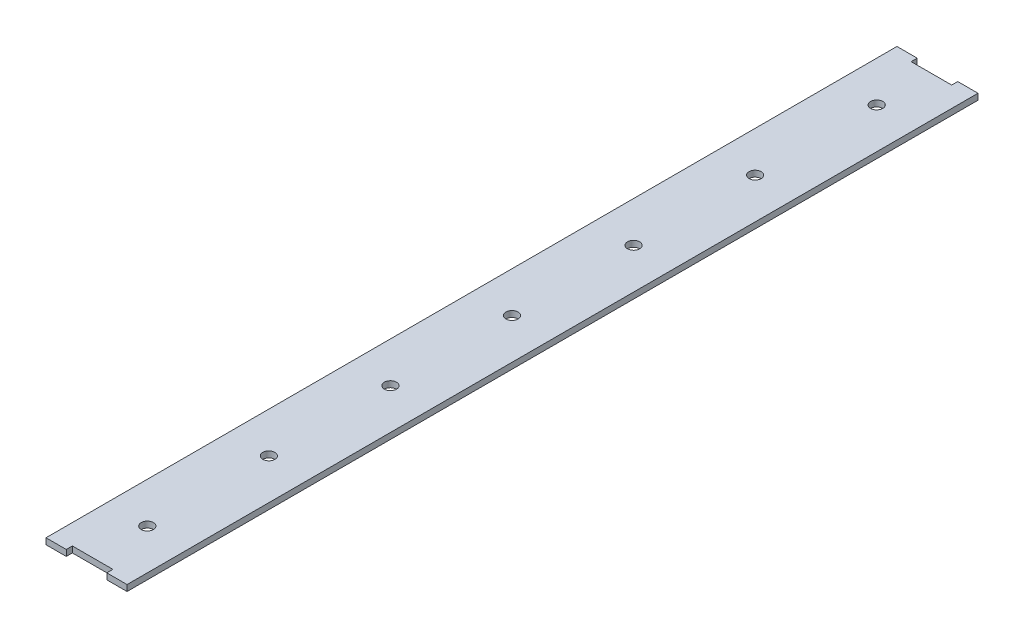
ISO-10303-21;
HEADER;
FILE_DESCRIPTION(('STEP AP214'),'2;1');
FILE_NAME('part.step','',(''),(''),'','','');
FILE_SCHEMA(('AUTOMOTIVE_DESIGN { 1 0 10303 214 1 1 1 1 }'));
ENDSEC;
DATA;
#1=APPLICATION_CONTEXT('core data for automotive mechanical design processes');
#2=APPLICATION_PROTOCOL_DEFINITION('international standard','automotive_design',2000,#1);
#3=PRODUCT_CONTEXT('',#1,'mechanical');
#4=PRODUCT('Part','Part','',(#3));
#5=PRODUCT_RELATED_PRODUCT_CATEGORY('part','',(#4));
#6=PRODUCT_DEFINITION_FORMATION('','',#4);
#7=PRODUCT_DEFINITION_CONTEXT('part definition',#1,'design');
#8=PRODUCT_DEFINITION('design','',#6,#7);
#9=PRODUCT_DEFINITION_SHAPE('','',#8);
#10=(LENGTH_UNIT() NAMED_UNIT(*) SI_UNIT(.MILLI.,.METRE.));
#11=(NAMED_UNIT(*) PLANE_ANGLE_UNIT() SI_UNIT($,.RADIAN.));
#12=(NAMED_UNIT(*) SI_UNIT($,.STERADIAN.) SOLID_ANGLE_UNIT());
#13=UNCERTAINTY_MEASURE_WITH_UNIT(LENGTH_MEASURE(1.E-05),#10,'distance_accuracy_value','');
#14=(GEOMETRIC_REPRESENTATION_CONTEXT(3) GLOBAL_UNCERTAINTY_ASSIGNED_CONTEXT((#13)) GLOBAL_UNIT_ASSIGNED_CONTEXT((#10,
#11,#12)) REPRESENTATION_CONTEXT('',''));
#15=CARTESIAN_POINT('',(0.,0.,0.));
#16=DIRECTION('',(0.,0.,1.));
#17=DIRECTION('',(1.,0.,0.));
#18=AXIS2_PLACEMENT_3D('',#15,#16,#17);
#19=CARTESIAN_POINT('',(0.,3.,-420.));
#20=DIRECTION('',(0.,0.,-1.));
#21=DIRECTION('',(-1.,0.,0.));
#22=AXIS2_PLACEMENT_3D('',#19,#20,#21);
#23=PLANE('',#22);
#24=DIRECTION('',(1.,0.,0.));
#25=VECTOR('',#24,1.);
#26=CARTESIAN_POINT('',(0.,0.,-420.));
#27=LINE('',#26,#25);
#28=CARTESIAN_POINT('',(9.99999999999995,0.,-420.));
#29=VERTEX_POINT('',#28);
#30=CARTESIAN_POINT('',(20.,0.,-420.));
#31=VERTEX_POINT('',#30);
#32=EDGE_CURVE('E196',#29,#31,#27,.T.);
#33=ORIENTED_EDGE('',*,*,#32,.F.);
#34=DIRECTION('',(0.,-1.,0.));
#35=VECTOR('',#34,1.);
#36=CARTESIAN_POINT('',(9.99999999999995,3.,-420.));
#37=LINE('',#36,#35);
#38=CARTESIAN_POINT('',(9.99999999999995,3.,-420.));
#39=VERTEX_POINT('',#38);
#40=EDGE_CURVE('E11',#39,#29,#37,.T.);
#41=ORIENTED_EDGE('',*,*,#40,.F.);
#42=DIRECTION('',(1.,0.,0.));
#43=VECTOR('',#42,1.);
#44=CARTESIAN_POINT('',(0.,3.,-420.));
#45=LINE('',#44,#43);
#46=CARTESIAN_POINT('',(20.,3.,-420.));
#47=VERTEX_POINT('',#46);
#48=EDGE_CURVE('E288',#39,#47,#45,.T.);
#49=ORIENTED_EDGE('',*,*,#48,.T.);
#50=DIRECTION('',(0.,-1.,0.));
#51=VECTOR('',#50,1.);
#52=CARTESIAN_POINT('',(20.,3.,-420.));
#53=LINE('',#52,#51);
#54=EDGE_CURVE('E104',#47,#31,#53,.T.);
#55=ORIENTED_EDGE('',*,*,#54,.T.);
#56=EDGE_LOOP('',(#33,#41,#49,#55));
#57=FACE_BOUND('',#56,.T.);
#58=ADVANCED_FACE('F39',(#57),#23,.T.);
#59=CARTESIAN_POINT('',(10.0000000000068,3.,-1.61907524424611E-13));
#60=DIRECTION('',(1.,0.,0.));
#61=DIRECTION('',(0.,0.,-1.));
#62=AXIS2_PLACEMENT_3D('',#59,#60,#61);
#63=PLANE('',#62);
#64=DIRECTION('',(0.,0.,1.));
#65=VECTOR('',#64,1.);
#66=CARTESIAN_POINT('',(10.0000000000068,0.,-1.61907524424611E-13));
#67=LINE('',#66,#65);
#68=CARTESIAN_POINT('',(10.,0.,-417.));
#69=VERTEX_POINT('',#68);
#70=EDGE_CURVE('E199',#29,#69,#67,.T.);
#71=ORIENTED_EDGE('',*,*,#70,.T.);
#72=DIRECTION('',(0.,-1.,0.));
#73=VECTOR('',#72,1.);
#74=CARTESIAN_POINT('',(10.,3.,-417.));
#75=LINE('',#74,#73);
#76=CARTESIAN_POINT('',(10.,3.,-417.));
#77=VERTEX_POINT('',#76);
#78=EDGE_CURVE('E49',#77,#69,#75,.T.);
#79=ORIENTED_EDGE('',*,*,#78,.F.);
#80=DIRECTION('',(0.,0.,1.));
#81=VECTOR('',#80,1.);
#82=CARTESIAN_POINT('',(10.0000000000068,3.,-1.61907524424611E-13));
#83=LINE('',#82,#81);
#84=EDGE_CURVE('E281',#39,#77,#83,.T.);
#85=ORIENTED_EDGE('',*,*,#84,.F.);
#86=ORIENTED_EDGE('',*,*,#40,.T.);
#87=EDGE_LOOP('',(#71,#79,#85,#86));
#88=FACE_BOUND('',#87,.T.);
#89=ADVANCED_FACE('F269',(#88),#63,.F.);
#90=CARTESIAN_POINT('',(0.,3.,-417.));
#91=DIRECTION('',(0.,0.,-1.));
#92=DIRECTION('',(-1.,0.,0.));
#93=AXIS2_PLACEMENT_3D('',#90,#91,#92);
#94=PLANE('',#93);
#95=DIRECTION('',(1.,0.,0.));
#96=VECTOR('',#95,1.);
#97=CARTESIAN_POINT('',(0.,0.,-417.));
#98=LINE('',#97,#96);
#99=CARTESIAN_POINT('',(-10.,0.,-417.));
#100=VERTEX_POINT('',#99);
#101=EDGE_CURVE('E204',#100,#69,#98,.T.);
#102=ORIENTED_EDGE('',*,*,#101,.F.);
#103=DIRECTION('',(0.,-1.,0.));
#104=VECTOR('',#103,1.);
#105=CARTESIAN_POINT('',(-10.,3.,-417.));
#106=LINE('',#105,#104);
#107=CARTESIAN_POINT('',(-10.,3.,-417.));
#108=VERTEX_POINT('',#107);
#109=EDGE_CURVE('E257',#108,#100,#106,.T.);
#110=ORIENTED_EDGE('',*,*,#109,.F.);
#111=DIRECTION('',(1.,0.,0.));
#112=VECTOR('',#111,1.);
#113=CARTESIAN_POINT('',(0.,3.,-417.));
#114=LINE('',#113,#112);
#115=EDGE_CURVE('E266',#108,#77,#114,.T.);
#116=ORIENTED_EDGE('',*,*,#115,.T.);
#117=ORIENTED_EDGE('',*,*,#78,.T.);
#118=EDGE_LOOP('',(#102,#110,#116,#117));
#119=FACE_BOUND('',#118,.T.);
#120=ADVANCED_FACE('F264',(#119),#94,.T.);
#121=CARTESIAN_POINT('',(-10.000000000007,3.,-1.67689936011208E-13));
#122=DIRECTION('',(1.,0.,0.));
#123=DIRECTION('',(0.,0.,-1.));
#124=AXIS2_PLACEMENT_3D('',#121,#122,#123);
#125=PLANE('',#124);
#126=DIRECTION('',(0.,0.,1.));
#127=VECTOR('',#126,1.);
#128=CARTESIAN_POINT('',(-10.000000000007,0.,-1.67689936011208E-13));
#129=LINE('',#128,#127);
#130=CARTESIAN_POINT('',(-9.99999999999995,0.,-420.));
#131=VERTEX_POINT('',#130);
#132=EDGE_CURVE('E208',#131,#100,#129,.T.);
#133=ORIENTED_EDGE('',*,*,#132,.F.);
#134=DIRECTION('',(0.,-1.,0.));
#135=VECTOR('',#134,1.);
#136=CARTESIAN_POINT('',(-9.99999999999995,3.,-420.));
#137=LINE('',#136,#135);
#138=CARTESIAN_POINT('',(-9.99999999999995,3.,-420.));
#139=VERTEX_POINT('',#138);
#140=EDGE_CURVE('E254',#139,#131,#137,.T.);
#141=ORIENTED_EDGE('',*,*,#140,.F.);
#142=DIRECTION('',(0.,0.,1.));
#143=VECTOR('',#142,1.);
#144=CARTESIAN_POINT('',(-10.000000000007,3.,-1.67689936011208E-13));
#145=LINE('',#144,#143);
#146=EDGE_CURVE('E278',#139,#108,#145,.T.);
#147=ORIENTED_EDGE('',*,*,#146,.T.);
#148=ORIENTED_EDGE('',*,*,#109,.T.);
#149=EDGE_LOOP('',(#133,#141,#147,#148));
#150=FACE_BOUND('',#149,.T.);
#151=ADVANCED_FACE('F275',(#150),#125,.T.);
#152=CARTESIAN_POINT('',(-20.0000000000002,0.,-420.));
#153=VERTEX_POINT('',#152);
#154=EDGE_CURVE('E200',#153,#131,#27,.T.);
#155=ORIENTED_EDGE('',*,*,#154,.F.);
#156=DIRECTION('',(0.,-1.,0.));
#157=VECTOR('',#156,1.);
#158=CARTESIAN_POINT('',(-20.0000000000002,3.,-420.));
#159=LINE('',#158,#157);
#160=CARTESIAN_POINT('',(-20.0000000000002,3.,-420.));
#161=VERTEX_POINT('',#160);
#162=EDGE_CURVE('E251',#161,#153,#159,.T.);
#163=ORIENTED_EDGE('',*,*,#162,.F.);
#164=EDGE_CURVE('E286',#161,#139,#45,.T.);
#165=ORIENTED_EDGE('',*,*,#164,.T.);
#166=ORIENTED_EDGE('',*,*,#140,.T.);
#167=EDGE_LOOP('',(#155,#163,#165,#166));
#168=FACE_BOUND('',#167,.T.);
#169=ADVANCED_FACE('F338',(#168),#23,.T.);
#170=CARTESIAN_POINT('',(-20.,3.,0.));
#171=DIRECTION('',(-1.,0.,0.));
#172=DIRECTION('',(0.,0.,1.));
#173=AXIS2_PLACEMENT_3D('',#170,#171,#172);
#174=PLANE('',#173);
#175=DIRECTION('',(0.,0.,-1.));
#176=VECTOR('',#175,1.);
#177=CARTESIAN_POINT('',(-20.,0.,0.));
#178=LINE('',#177,#176);
#179=CARTESIAN_POINT('',(-20.,0.,0.));
#180=VERTEX_POINT('',#179);
#181=EDGE_CURVE('E212',#180,#153,#178,.T.);
#182=ORIENTED_EDGE('',*,*,#181,.F.);
#183=DIRECTION('',(0.,-1.,0.));
#184=VECTOR('',#183,1.);
#185=CARTESIAN_POINT('',(-20.,3.,0.));
#186=LINE('',#185,#184);
#187=CARTESIAN_POINT('',(-20.,3.,0.));
#188=VERTEX_POINT('',#187);
#189=EDGE_CURVE('E248',#188,#180,#186,.T.);
#190=ORIENTED_EDGE('',*,*,#189,.F.);
#191=DIRECTION('',(0.,0.,-1.));
#192=VECTOR('',#191,1.);
#193=CARTESIAN_POINT('',(-20.,3.,0.));
#194=LINE('',#193,#192);
#195=EDGE_CURVE('E292',#188,#161,#194,.T.);
#196=ORIENTED_EDGE('',*,*,#195,.T.);
#197=ORIENTED_EDGE('',*,*,#162,.T.);
#198=EDGE_LOOP('',(#182,#190,#196,#197));
#199=FACE_BOUND('',#198,.T.);
#200=ADVANCED_FACE('F341',(#199),#174,.T.);
#201=CARTESIAN_POINT('',(0.,3.,0.));
#202=DIRECTION('',(0.,0.,-1.));
#203=DIRECTION('',(-1.,0.,0.));
#204=AXIS2_PLACEMENT_3D('',#201,#202,#203);
#205=PLANE('',#204);
#206=DIRECTION('',(1.,0.,0.));
#207=VECTOR('',#206,1.);
#208=CARTESIAN_POINT('',(0.,0.,0.));
#209=LINE('',#208,#207);
#210=CARTESIAN_POINT('',(-10.,0.,0.));
#211=VERTEX_POINT('',#210);
#212=EDGE_CURVE('E216',#180,#211,#209,.T.);
#213=ORIENTED_EDGE('',*,*,#212,.T.);
#214=DIRECTION('',(0.,-1.,0.));
#215=VECTOR('',#214,1.);
#216=CARTESIAN_POINT('',(-10.,3.,0.));
#217=LINE('',#216,#215);
#218=CARTESIAN_POINT('',(-10.,3.,0.));
#219=VERTEX_POINT('',#218);
#220=EDGE_CURVE('E244',#219,#211,#217,.T.);
#221=ORIENTED_EDGE('',*,*,#220,.F.);
#222=DIRECTION('',(1.,0.,0.));
#223=VECTOR('',#222,1.);
#224=CARTESIAN_POINT('',(0.,3.,0.));
#225=LINE('',#224,#223);
#226=EDGE_CURVE('E154',#188,#219,#225,.T.);
#227=ORIENTED_EDGE('',*,*,#226,.F.);
#228=ORIENTED_EDGE('',*,*,#189,.T.);
#229=EDGE_LOOP('',(#213,#221,#227,#228));
#230=FACE_BOUND('',#229,.T.);
#231=ADVANCED_FACE('F344',(#230),#205,.F.);
#232=CARTESIAN_POINT('',(-10.,3.,0.));
#233=DIRECTION('',(-1.,0.,0.));
#234=DIRECTION('',(0.,0.,1.));
#235=AXIS2_PLACEMENT_3D('',#232,#233,#234);
#236=PLANE('',#235);
#237=DIRECTION('',(0.,0.,-1.));
#238=VECTOR('',#237,1.);
#239=CARTESIAN_POINT('',(-10.,0.,0.));
#240=LINE('',#239,#238);
#241=CARTESIAN_POINT('',(-10.,0.,-3.));
#242=VERTEX_POINT('',#241);
#243=EDGE_CURVE('E220',#211,#242,#240,.T.);
#244=ORIENTED_EDGE('',*,*,#243,.T.);
#245=DIRECTION('',(0.,-1.,0.));
#246=VECTOR('',#245,1.);
#247=CARTESIAN_POINT('',(-10.,3.,-3.));
#248=LINE('',#247,#246);
#249=CARTESIAN_POINT('',(-10.,3.,-3.));
#250=VERTEX_POINT('',#249);
#251=EDGE_CURVE('E240',#250,#242,#248,.T.);
#252=ORIENTED_EDGE('',*,*,#251,.F.);
#253=DIRECTION('',(0.,0.,-1.));
#254=VECTOR('',#253,1.);
#255=CARTESIAN_POINT('',(-10.,3.,0.));
#256=LINE('',#255,#254);
#257=EDGE_CURVE('E162',#219,#250,#256,.T.);
#258=ORIENTED_EDGE('',*,*,#257,.F.);
#259=ORIENTED_EDGE('',*,*,#220,.T.);
#260=EDGE_LOOP('',(#244,#252,#258,#259));
#261=FACE_BOUND('',#260,.T.);
#262=ADVANCED_FACE('F303',(#261),#236,.F.);
#263=CARTESIAN_POINT('',(0.,3.,-3.));
#264=DIRECTION('',(0.,0.,-1.));
#265=DIRECTION('',(-1.,0.,0.));
#266=AXIS2_PLACEMENT_3D('',#263,#264,#265);
#267=PLANE('',#266);
#268=DIRECTION('',(1.,0.,0.));
#269=VECTOR('',#268,1.);
#270=CARTESIAN_POINT('',(0.,0.,-3.));
#271=LINE('',#270,#269);
#272=CARTESIAN_POINT('',(10.,0.,-3.));
#273=VERTEX_POINT('',#272);
#274=EDGE_CURVE('E225',#242,#273,#271,.T.);
#275=ORIENTED_EDGE('',*,*,#274,.T.);
#276=DIRECTION('',(0.,-1.,0.));
#277=VECTOR('',#276,1.);
#278=CARTESIAN_POINT('',(10.,3.,-3.));
#279=LINE('',#278,#277);
#280=CARTESIAN_POINT('',(10.,3.,-3.));
#281=VERTEX_POINT('',#280);
#282=EDGE_CURVE('E146',#281,#273,#279,.T.);
#283=ORIENTED_EDGE('',*,*,#282,.F.);
#284=DIRECTION('',(1.,0.,0.));
#285=VECTOR('',#284,1.);
#286=CARTESIAN_POINT('',(0.,3.,-3.));
#287=LINE('',#286,#285);
#288=EDGE_CURVE('E157',#250,#281,#287,.T.);
#289=ORIENTED_EDGE('',*,*,#288,.F.);
#290=ORIENTED_EDGE('',*,*,#251,.T.);
#291=EDGE_LOOP('',(#275,#283,#289,#290));
#292=FACE_BOUND('',#291,.T.);
#293=ADVANCED_FACE('F305',(#292),#267,.F.);
#294=CARTESIAN_POINT('',(10.,3.,0.));
#295=DIRECTION('',(-1.,0.,0.));
#296=DIRECTION('',(0.,0.,1.));
#297=AXIS2_PLACEMENT_3D('',#294,#295,#296);
#298=PLANE('',#297);
#299=DIRECTION('',(0.,0.,-1.));
#300=VECTOR('',#299,1.);
#301=CARTESIAN_POINT('',(10.,0.,0.));
#302=LINE('',#301,#300);
#303=CARTESIAN_POINT('',(10.,0.,0.));
#304=VERTEX_POINT('',#303);
#305=EDGE_CURVE('E142',#304,#273,#302,.T.);
#306=ORIENTED_EDGE('',*,*,#305,.F.);
#307=DIRECTION('',(0.,-1.,0.));
#308=VECTOR('',#307,1.);
#309=CARTESIAN_POINT('',(10.,3.,0.));
#310=LINE('',#309,#308);
#311=CARTESIAN_POINT('',(10.,3.,0.));
#312=VERTEX_POINT('',#311);
#313=EDGE_CURVE('E136',#312,#304,#310,.T.);
#314=ORIENTED_EDGE('',*,*,#313,.F.);
#315=DIRECTION('',(0.,0.,-1.));
#316=VECTOR('',#315,1.);
#317=CARTESIAN_POINT('',(10.,3.,0.));
#318=LINE('',#317,#316);
#319=EDGE_CURVE('E140',#312,#281,#318,.T.);
#320=ORIENTED_EDGE('',*,*,#319,.T.);
#321=ORIENTED_EDGE('',*,*,#282,.T.);
#322=EDGE_LOOP('',(#306,#314,#320,#321));
#323=FACE_BOUND('',#322,.T.);
#324=ADVANCED_FACE('F138',(#323),#298,.T.);
#325=CARTESIAN_POINT('',(20.,0.,0.));
#326=VERTEX_POINT('',#325);
#327=EDGE_CURVE('E221',#304,#326,#209,.T.);
#328=ORIENTED_EDGE('',*,*,#327,.T.);
#329=DIRECTION('',(0.,-1.,0.));
#330=VECTOR('',#329,1.);
#331=CARTESIAN_POINT('',(20.,3.,0.));
#332=LINE('',#331,#330);
#333=CARTESIAN_POINT('',(20.,3.,0.));
#334=VERTEX_POINT('',#333);
#335=EDGE_CURVE('E147',#334,#326,#332,.T.);
#336=ORIENTED_EDGE('',*,*,#335,.F.);
#337=EDGE_CURVE('E150',#312,#334,#225,.T.);
#338=ORIENTED_EDGE('',*,*,#337,.F.);
#339=ORIENTED_EDGE('',*,*,#313,.T.);
#340=EDGE_LOOP('',(#328,#336,#338,#339));
#341=FACE_BOUND('',#340,.T.);
#342=ADVANCED_FACE('F151',(#341),#205,.F.);
#343=CARTESIAN_POINT('',(0.,3.,-30.));
#344=DIRECTION('',(0.,-1.,0.));
#345=DIRECTION('',(0.,0.,-1.));
#346=AXIS2_PLACEMENT_3D('',#343,#344,#345);
#347=CYLINDRICAL_SURFACE('',#346,3.);
#348=CARTESIAN_POINT('',(0.,3.,-30.));
#349=DIRECTION('',(0.,1.,0.));
#350=DIRECTION('',(0.,0.,1.));
#351=AXIS2_PLACEMENT_3D('',#348,#349,#350);
#352=CIRCLE('',#351,3.);
#353=CARTESIAN_POINT('',(0.,3.,-27.));
#354=VERTEX_POINT('',#353);
#355=EDGE_CURVE('E331',#354,#354,#352,.T.);
#356=ORIENTED_EDGE('',*,*,#355,.T.);
#357=EDGE_LOOP('',(#356));
#358=FACE_BOUND('',#357,.T.);
#359=CARTESIAN_POINT('',(0.,0.,-30.));
#360=DIRECTION('',(0.,1.,0.));
#361=DIRECTION('',(0.,0.,1.));
#362=AXIS2_PLACEMENT_3D('',#359,#360,#361);
#363=CIRCLE('',#362,3.);
#364=CARTESIAN_POINT('',(0.,0.,-27.));
#365=VERTEX_POINT('',#364);
#366=EDGE_CURVE('E192',#365,#365,#363,.T.);
#367=ORIENTED_EDGE('',*,*,#366,.F.);
#368=EDGE_LOOP('',(#367));
#369=FACE_BOUND('',#368,.T.);
#370=ADVANCED_FACE('F356',(#358,#369),#347,.F.);
#371=CARTESIAN_POINT('',(-2.05814939933146E-13,3.,-90.));
#372=DIRECTION('',(0.,-1.,0.));
#373=DIRECTION('',(0.,0.,-1.));
#374=AXIS2_PLACEMENT_3D('',#371,#372,#373);
#375=CYLINDRICAL_SURFACE('',#374,3.);
#376=CARTESIAN_POINT('',(-2.05814939933146E-13,3.,-90.));
#377=DIRECTION('',(0.,1.,0.));
#378=DIRECTION('',(0.,0.,1.));
#379=AXIS2_PLACEMENT_3D('',#376,#377,#378);
#380=CIRCLE('',#379,3.);
#381=CARTESIAN_POINT('',(-2.05814939933146E-13,3.,-87.));
#382=VERTEX_POINT('',#381);
#383=EDGE_CURVE('E327',#382,#382,#380,.T.);
#384=ORIENTED_EDGE('',*,*,#383,.T.);
#385=EDGE_LOOP('',(#384));
#386=FACE_BOUND('',#385,.T.);
#387=CARTESIAN_POINT('',(-2.05814939933146E-13,0.,-90.));
#388=DIRECTION('',(0.,1.,0.));
#389=DIRECTION('',(0.,0.,1.));
#390=AXIS2_PLACEMENT_3D('',#387,#388,#389);
#391=CIRCLE('',#390,3.);
#392=CARTESIAN_POINT('',(-2.05814939933146E-13,0.,-87.));
#393=VERTEX_POINT('',#392);
#394=EDGE_CURVE('E188',#393,#393,#391,.T.);
#395=ORIENTED_EDGE('',*,*,#394,.F.);
#396=EDGE_LOOP('',(#395));
#397=FACE_BOUND('',#396,.T.);
#398=ADVANCED_FACE('F375',(#386,#397),#375,.F.);
#399=CARTESIAN_POINT('',(-4.11629879866292E-13,3.,-150.));
#400=DIRECTION('',(0.,-1.,0.));
#401=DIRECTION('',(0.,0.,-1.));
#402=AXIS2_PLACEMENT_3D('',#399,#400,#401);
#403=CYLINDRICAL_SURFACE('',#402,3.);
#404=CARTESIAN_POINT('',(-4.11629879866292E-13,3.,-150.));
#405=DIRECTION('',(0.,1.,0.));
#406=DIRECTION('',(0.,0.,1.));
#407=AXIS2_PLACEMENT_3D('',#404,#405,#406);
#408=CIRCLE('',#407,3.);
#409=CARTESIAN_POINT('',(-4.11629879866292E-13,3.,-147.));
#410=VERTEX_POINT('',#409);
#411=EDGE_CURVE('E323',#410,#410,#408,.T.);
#412=ORIENTED_EDGE('',*,*,#411,.T.);
#413=EDGE_LOOP('',(#412));
#414=FACE_BOUND('',#413,.T.);
#415=CARTESIAN_POINT('',(-4.11629879866292E-13,0.,-150.));
#416=DIRECTION('',(0.,1.,0.));
#417=DIRECTION('',(0.,0.,1.));
#418=AXIS2_PLACEMENT_3D('',#415,#416,#417);
#419=CIRCLE('',#418,3.);
#420=CARTESIAN_POINT('',(-4.11629879866292E-13,0.,-147.));
#421=VERTEX_POINT('',#420);
#422=EDGE_CURVE('E184',#421,#421,#419,.T.);
#423=ORIENTED_EDGE('',*,*,#422,.F.);
#424=EDGE_LOOP('',(#423));
#425=FACE_BOUND('',#424,.T.);
#426=ADVANCED_FACE('F379',(#414,#425),#403,.F.);
#427=CARTESIAN_POINT('',(-6.17444819799438E-13,3.,-210.));
#428=DIRECTION('',(0.,-1.,0.));
#429=DIRECTION('',(0.,0.,-1.));
#430=AXIS2_PLACEMENT_3D('',#427,#428,#429);
#431=CYLINDRICAL_SURFACE('',#430,3.);
#432=CARTESIAN_POINT('',(-6.17444819799438E-13,3.,-210.));
#433=DIRECTION('',(0.,1.,0.));
#434=DIRECTION('',(0.,0.,1.));
#435=AXIS2_PLACEMENT_3D('',#432,#433,#434);
#436=CIRCLE('',#435,3.);
#437=CARTESIAN_POINT('',(-6.17444819799438E-13,3.,-207.));
#438=VERTEX_POINT('',#437);
#439=EDGE_CURVE('E319',#438,#438,#436,.T.);
#440=ORIENTED_EDGE('',*,*,#439,.T.);
#441=EDGE_LOOP('',(#440));
#442=FACE_BOUND('',#441,.T.);
#443=CARTESIAN_POINT('',(-6.17444819799438E-13,0.,-210.));
#444=DIRECTION('',(0.,1.,0.));
#445=DIRECTION('',(0.,0.,1.));
#446=AXIS2_PLACEMENT_3D('',#443,#444,#445);
#447=CIRCLE('',#446,3.);
#448=CARTESIAN_POINT('',(-6.17444819799438E-13,0.,-207.));
#449=VERTEX_POINT('',#448);
#450=EDGE_CURVE('E180',#449,#449,#447,.T.);
#451=ORIENTED_EDGE('',*,*,#450,.F.);
#452=EDGE_LOOP('',(#451));
#453=FACE_BOUND('',#452,.T.);
#454=ADVANCED_FACE('F383',(#442,#453),#431,.F.);
#455=CARTESIAN_POINT('',(-8.23259759732584E-13,3.,-270.));
#456=DIRECTION('',(0.,-1.,0.));
#457=DIRECTION('',(0.,0.,-1.));
#458=AXIS2_PLACEMENT_3D('',#455,#456,#457);
#459=CYLINDRICAL_SURFACE('',#458,3.);
#460=CARTESIAN_POINT('',(-8.23259759732584E-13,3.,-270.));
#461=DIRECTION('',(0.,1.,0.));
#462=DIRECTION('',(0.,0.,1.));
#463=AXIS2_PLACEMENT_3D('',#460,#461,#462);
#464=CIRCLE('',#463,3.);
#465=CARTESIAN_POINT('',(-8.23259759732584E-13,3.,-267.));
#466=VERTEX_POINT('',#465);
#467=EDGE_CURVE('E315',#466,#466,#464,.T.);
#468=ORIENTED_EDGE('',*,*,#467,.T.);
#469=EDGE_LOOP('',(#468));
#470=FACE_BOUND('',#469,.T.);
#471=CARTESIAN_POINT('',(-8.23259759732584E-13,0.,-270.));
#472=DIRECTION('',(0.,1.,0.));
#473=DIRECTION('',(0.,0.,1.));
#474=AXIS2_PLACEMENT_3D('',#471,#472,#473);
#475=CIRCLE('',#474,3.);
#476=CARTESIAN_POINT('',(-8.23259759732584E-13,0.,-267.));
#477=VERTEX_POINT('',#476);
#478=EDGE_CURVE('E176',#477,#477,#475,.T.);
#479=ORIENTED_EDGE('',*,*,#478,.F.);
#480=EDGE_LOOP('',(#479));
#481=FACE_BOUND('',#480,.T.);
#482=ADVANCED_FACE('F387',(#470,#481),#459,.F.);
#483=CARTESIAN_POINT('',(-1.02907469966573E-12,3.,-330.));
#484=DIRECTION('',(0.,-1.,0.));
#485=DIRECTION('',(0.,0.,-1.));
#486=AXIS2_PLACEMENT_3D('',#483,#484,#485);
#487=CYLINDRICAL_SURFACE('',#486,3.);
#488=CARTESIAN_POINT('',(-1.02907469966573E-12,3.,-330.));
#489=DIRECTION('',(0.,1.,0.));
#490=DIRECTION('',(0.,0.,1.));
#491=AXIS2_PLACEMENT_3D('',#488,#489,#490);
#492=CIRCLE('',#491,3.);
#493=CARTESIAN_POINT('',(-1.02907469966573E-12,3.,-327.));
#494=VERTEX_POINT('',#493);
#495=EDGE_CURVE('E311',#494,#494,#492,.T.);
#496=ORIENTED_EDGE('',*,*,#495,.T.);
#497=EDGE_LOOP('',(#496));
#498=FACE_BOUND('',#497,.T.);
#499=CARTESIAN_POINT('',(-1.02907469966573E-12,0.,-330.));
#500=DIRECTION('',(0.,1.,0.));
#501=DIRECTION('',(0.,0.,1.));
#502=AXIS2_PLACEMENT_3D('',#499,#500,#501);
#503=CIRCLE('',#502,3.);
#504=CARTESIAN_POINT('',(-1.02907469966573E-12,0.,-327.));
#505=VERTEX_POINT('',#504);
#506=EDGE_CURVE('E172',#505,#505,#503,.T.);
#507=ORIENTED_EDGE('',*,*,#506,.F.);
#508=EDGE_LOOP('',(#507));
#509=FACE_BOUND('',#508,.T.);
#510=ADVANCED_FACE('F390',(#498,#509),#487,.F.);
#511=CARTESIAN_POINT('',(-1.23488963959888E-12,3.,-390.));
#512=DIRECTION('',(0.,-1.,0.));
#513=DIRECTION('',(0.,0.,-1.));
#514=AXIS2_PLACEMENT_3D('',#511,#512,#513);
#515=CYLINDRICAL_SURFACE('',#514,3.);
#516=CARTESIAN_POINT('',(-1.23488963959888E-12,3.,-390.));
#517=DIRECTION('',(0.,1.,0.));
#518=DIRECTION('',(0.,0.,1.));
#519=AXIS2_PLACEMENT_3D('',#516,#517,#518);
#520=CIRCLE('',#519,3.);
#521=CARTESIAN_POINT('',(-1.23488963959888E-12,3.,-387.));
#522=VERTEX_POINT('',#521);
#523=EDGE_CURVE('E233',#522,#522,#520,.T.);
#524=ORIENTED_EDGE('',*,*,#523,.T.);
#525=EDGE_LOOP('',(#524));
#526=FACE_BOUND('',#525,.T.);
#527=CARTESIAN_POINT('',(-1.23488963959888E-12,0.,-390.));
#528=DIRECTION('',(0.,1.,0.));
#529=DIRECTION('',(0.,0.,1.));
#530=AXIS2_PLACEMENT_3D('',#527,#528,#529);
#531=CIRCLE('',#530,3.);
#532=CARTESIAN_POINT('',(-1.23488963959888E-12,0.,-387.));
#533=VERTEX_POINT('',#532);
#534=EDGE_CURVE('E168',#533,#533,#531,.T.);
#535=ORIENTED_EDGE('',*,*,#534,.F.);
#536=EDGE_LOOP('',(#535));
#537=FACE_BOUND('',#536,.T.);
#538=ADVANCED_FACE('F41',(#526,#537),#515,.F.);
#539=CARTESIAN_POINT('',(20.,3.,0.));
#540=DIRECTION('',(-1.,0.,0.));
#541=DIRECTION('',(0.,0.,1.));
#542=AXIS2_PLACEMENT_3D('',#539,#540,#541);
#543=PLANE('',#542);
#544=DIRECTION('',(0.,0.,-1.));
#545=VECTOR('',#544,1.);
#546=CARTESIAN_POINT('',(20.,0.,0.));
#547=LINE('',#546,#545);
#548=EDGE_CURVE('E97',#326,#31,#547,.T.);
#549=ORIENTED_EDGE('',*,*,#548,.T.);
#550=ORIENTED_EDGE('',*,*,#54,.F.);
#551=DIRECTION('',(0.,0.,-1.));
#552=VECTOR('',#551,1.);
#553=CARTESIAN_POINT('',(20.,3.,0.));
#554=LINE('',#553,#552);
#555=EDGE_CURVE('E57',#334,#47,#554,.T.);
#556=ORIENTED_EDGE('',*,*,#555,.F.);
#557=ORIENTED_EDGE('',*,*,#335,.T.);
#558=EDGE_LOOP('',(#549,#550,#556,#557));
#559=FACE_BOUND('',#558,.T.);
#560=ADVANCED_FACE('F397',(#559),#543,.F.);
#561=CARTESIAN_POINT('',(0.,3.,0.));
#562=DIRECTION('',(0.,1.,0.));
#563=DIRECTION('',(0.,0.,1.));
#564=AXIS2_PLACEMENT_3D('',#561,#562,#563);
#565=PLANE('',#564);
#566=ORIENTED_EDGE('',*,*,#523,.F.);
#567=EDGE_LOOP('',(#566));
#568=FACE_BOUND('',#567,.T.);
#569=ORIENTED_EDGE('',*,*,#495,.F.);
#570=EDGE_LOOP('',(#569));
#571=FACE_BOUND('',#570,.T.);
#572=ORIENTED_EDGE('',*,*,#467,.F.);
#573=EDGE_LOOP('',(#572));
#574=FACE_BOUND('',#573,.T.);
#575=ORIENTED_EDGE('',*,*,#439,.F.);
#576=EDGE_LOOP('',(#575));
#577=FACE_BOUND('',#576,.T.);
#578=ORIENTED_EDGE('',*,*,#411,.F.);
#579=EDGE_LOOP('',(#578));
#580=FACE_BOUND('',#579,.T.);
#581=ORIENTED_EDGE('',*,*,#383,.F.);
#582=EDGE_LOOP('',(#581));
#583=FACE_BOUND('',#582,.T.);
#584=ORIENTED_EDGE('',*,*,#355,.F.);
#585=EDGE_LOOP('',(#584));
#586=FACE_BOUND('',#585,.T.);
#587=ORIENTED_EDGE('',*,*,#48,.F.);
#588=ORIENTED_EDGE('',*,*,#84,.T.);
#589=ORIENTED_EDGE('',*,*,#115,.F.);
#590=ORIENTED_EDGE('',*,*,#146,.F.);
#591=ORIENTED_EDGE('',*,*,#164,.F.);
#592=ORIENTED_EDGE('',*,*,#195,.F.);
#593=ORIENTED_EDGE('',*,*,#226,.T.);
#594=ORIENTED_EDGE('',*,*,#257,.T.);
#595=ORIENTED_EDGE('',*,*,#288,.T.);
#596=ORIENTED_EDGE('',*,*,#319,.F.);
#597=ORIENTED_EDGE('',*,*,#337,.T.);
#598=ORIENTED_EDGE('',*,*,#555,.T.);
#599=EDGE_LOOP('',(#587,#588,#589,#590,#591,#592,#593,#594,#595,#596,#597,#598));
#600=FACE_BOUND('',#599,.T.);
#601=ADVANCED_FACE('F155',(#568,#571,#574,#577,#580,#583,#586,#600),#565,.T.);
#602=CARTESIAN_POINT('',(0.,0.,0.));
#603=DIRECTION('',(0.,1.,0.));
#604=DIRECTION('',(0.,0.,1.));
#605=AXIS2_PLACEMENT_3D('',#602,#603,#604);
#606=PLANE('',#605);
#607=ORIENTED_EDGE('',*,*,#534,.T.);
#608=EDGE_LOOP('',(#607));
#609=FACE_BOUND('',#608,.T.);
#610=ORIENTED_EDGE('',*,*,#506,.T.);
#611=EDGE_LOOP('',(#610));
#612=FACE_BOUND('',#611,.T.);
#613=ORIENTED_EDGE('',*,*,#478,.T.);
#614=EDGE_LOOP('',(#613));
#615=FACE_BOUND('',#614,.T.);
#616=ORIENTED_EDGE('',*,*,#450,.T.);
#617=EDGE_LOOP('',(#616));
#618=FACE_BOUND('',#617,.T.);
#619=ORIENTED_EDGE('',*,*,#422,.T.);
#620=EDGE_LOOP('',(#619));
#621=FACE_BOUND('',#620,.T.);
#622=ORIENTED_EDGE('',*,*,#394,.T.);
#623=EDGE_LOOP('',(#622));
#624=FACE_BOUND('',#623,.T.);
#625=ORIENTED_EDGE('',*,*,#366,.T.);
#626=EDGE_LOOP('',(#625));
#627=FACE_BOUND('',#626,.T.);
#628=ORIENTED_EDGE('',*,*,#32,.T.);
#629=ORIENTED_EDGE('',*,*,#548,.F.);
#630=ORIENTED_EDGE('',*,*,#327,.F.);
#631=ORIENTED_EDGE('',*,*,#305,.T.);
#632=ORIENTED_EDGE('',*,*,#274,.F.);
#633=ORIENTED_EDGE('',*,*,#243,.F.);
#634=ORIENTED_EDGE('',*,*,#212,.F.);
#635=ORIENTED_EDGE('',*,*,#181,.T.);
#636=ORIENTED_EDGE('',*,*,#154,.T.);
#637=ORIENTED_EDGE('',*,*,#132,.T.);
#638=ORIENTED_EDGE('',*,*,#101,.T.);
#639=ORIENTED_EDGE('',*,*,#70,.F.);
#640=EDGE_LOOP('',(#628,#629,#630,#631,#632,#633,#634,#635,#636,#637,#638,#639));
#641=FACE_BOUND('',#640,.T.);
#642=ADVANCED_FACE('F270',(#609,#612,#615,#618,#621,#624,#627,#641),#606,.F.);
#643=CLOSED_SHELL('',(#58,#89,#120,#151,#169,#200,#231,#262,#293,#324,#342,#370,#398,#426,#454,
#482,#510,#538,#560,#601,#642));
#644=MANIFOLD_SOLID_BREP('B2',#643);
#645=ADVANCED_BREP_SHAPE_REPRESENTATION('',(#18,#644),#14);
#646=SHAPE_DEFINITION_REPRESENTATION(#9,#645);
ENDSEC;
END-ISO-10303-21;
